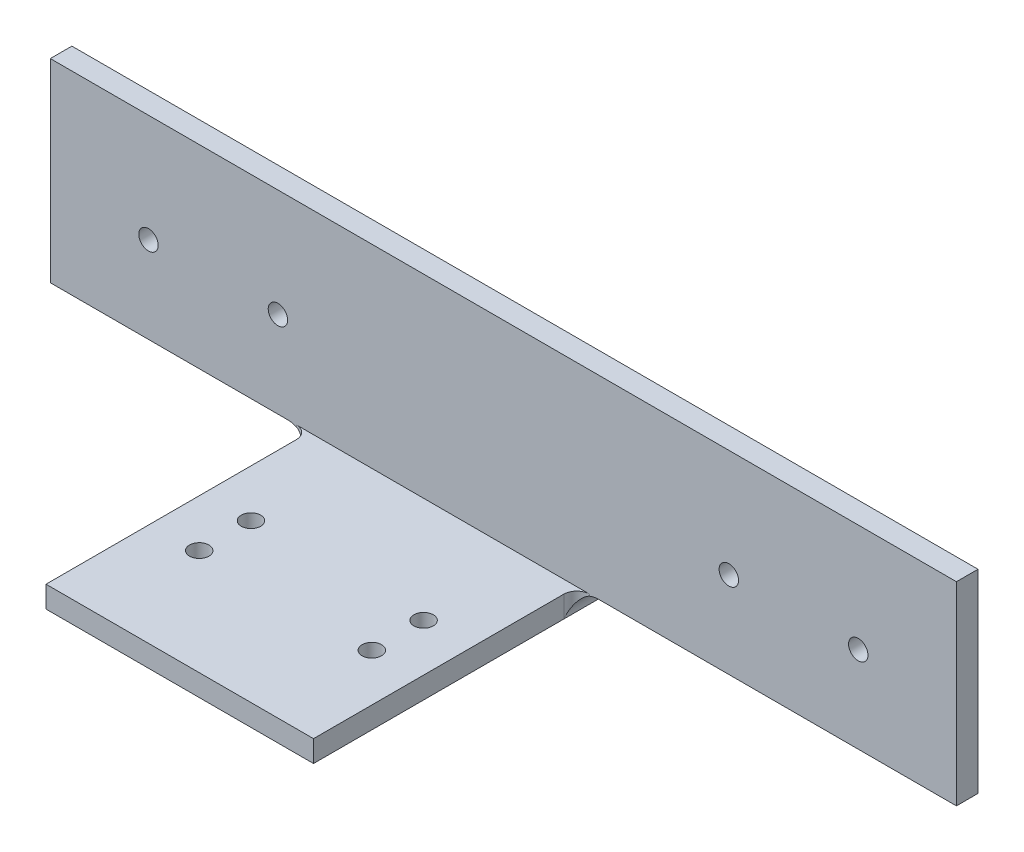
ISO-10303-21;
HEADER;
FILE_DESCRIPTION(('STEP AP214'),'2;1');
FILE_NAME('part.step','',(''),(''),'','','');
FILE_SCHEMA(('AUTOMOTIVE_DESIGN { 1 0 10303 214 1 1 1 1 }'));
ENDSEC;
DATA;
#1=APPLICATION_CONTEXT('core data for automotive mechanical design processes');
#2=APPLICATION_PROTOCOL_DEFINITION('international standard','automotive_design',2000,#1);
#3=PRODUCT_CONTEXT('',#1,'mechanical');
#4=PRODUCT('Part','Part','',(#3));
#5=PRODUCT_RELATED_PRODUCT_CATEGORY('part','',(#4));
#6=PRODUCT_DEFINITION_FORMATION('','',#4);
#7=PRODUCT_DEFINITION_CONTEXT('part definition',#1,'design');
#8=PRODUCT_DEFINITION('design','',#6,#7);
#9=PRODUCT_DEFINITION_SHAPE('','',#8);
#10=(LENGTH_UNIT() NAMED_UNIT(*) SI_UNIT(.MILLI.,.METRE.));
#11=(NAMED_UNIT(*) PLANE_ANGLE_UNIT() SI_UNIT($,.RADIAN.));
#12=(NAMED_UNIT(*) SI_UNIT($,.STERADIAN.) SOLID_ANGLE_UNIT());
#13=UNCERTAINTY_MEASURE_WITH_UNIT(LENGTH_MEASURE(1.E-05),#10,'distance_accuracy_value','');
#14=(GEOMETRIC_REPRESENTATION_CONTEXT(3) GLOBAL_UNCERTAINTY_ASSIGNED_CONTEXT((#13)) GLOBAL_UNIT_ASSIGNED_CONTEXT((#10,
#11,#12)) REPRESENTATION_CONTEXT('',''));
#15=CARTESIAN_POINT('',(0.,0.,0.));
#16=DIRECTION('',(0.,0.,1.));
#17=DIRECTION('',(1.,0.,0.));
#18=AXIS2_PLACEMENT_3D('',#15,#16,#17);
#19=CARTESIAN_POINT('',(210.,50.,-0.00999999999999959));
#20=DIRECTION('',(-1.,0.,0.));
#21=DIRECTION('',(0.,0.,1.));
#22=AXIS2_PLACEMENT_3D('',#19,#20,#21);
#23=PLANE('',#22);
#24=DIRECTION('',(0.,1.,0.));
#25=VECTOR('',#24,1.);
#26=CARTESIAN_POINT('',(210.,0.,0.));
#27=LINE('',#26,#25);
#28=CARTESIAN_POINT('',(210.,5.,0.));
#29=VERTEX_POINT('',#28);
#30=CARTESIAN_POINT('',(210.,50.,0.));
#31=VERTEX_POINT('',#30);
#32=EDGE_CURVE('E322',#29,#31,#27,.T.);
#33=ORIENTED_EDGE('',*,*,#32,.F.);
#34=DIRECTION('',(0.,0.,1.));
#35=VECTOR('',#34,1.);
#36=CARTESIAN_POINT('',(210.,5.,-0.001000000000001));
#37=LINE('',#36,#35);
#38=CARTESIAN_POINT('',(210.,5.,5.));
#39=VERTEX_POINT('',#38);
#40=EDGE_CURVE('E332',#29,#39,#37,.T.);
#41=ORIENTED_EDGE('',*,*,#40,.T.);
#42=DIRECTION('',(0.,1.,0.));
#43=VECTOR('',#42,1.);
#44=CARTESIAN_POINT('',(210.,0.,5.));
#45=LINE('',#44,#43);
#46=CARTESIAN_POINT('',(210.,50.,5.));
#47=VERTEX_POINT('',#46);
#48=EDGE_CURVE('E326',#39,#47,#45,.T.);
#49=ORIENTED_EDGE('',*,*,#48,.T.);
#50=DIRECTION('',(0.,0.,-1.));
#51=VECTOR('',#50,1.);
#52=CARTESIAN_POINT('',(210.,50.,5.));
#53=LINE('',#52,#51);
#54=EDGE_CURVE('E329',#47,#31,#53,.T.);
#55=ORIENTED_EDGE('',*,*,#54,.T.);
#56=EDGE_LOOP('',(#33,#41,#49,#55));
#57=FACE_BOUND('',#56,.T.);
#58=ADVANCED_FACE('F37',(#57),#23,.T.);
#59=CARTESIAN_POINT('',(0.,0.,0.));
#60=DIRECTION('',(0.,0.,-1.));
#61=DIRECTION('',(-1.,0.,0.));
#62=AXIS2_PLACEMENT_3D('',#59,#60,#61);
#63=PLANE('',#62);
#64=CARTESIAN_POINT('',(397.25,25.0000000000002,0.));
#65=DIRECTION('',(0.,0.,1.));
#66=DIRECTION('',(1.,0.,0.));
#67=AXIS2_PLACEMENT_3D('',#64,#65,#66);
#68=CIRCLE('',#67,2.25000000000001);
#69=CARTESIAN_POINT('',(399.5,25.0000000000002,0.));
#70=VERTEX_POINT('',#69);
#71=EDGE_CURVE('E273',#70,#70,#68,.T.);
#72=ORIENTED_EDGE('',*,*,#71,.T.);
#73=EDGE_LOOP('',(#72));
#74=FACE_BOUND('',#73,.T.);
#75=CARTESIAN_POINT('',(367.25,25.0000000000001,0.));
#76=DIRECTION('',(0.,0.,1.));
#77=DIRECTION('',(1.,0.,0.));
#78=AXIS2_PLACEMENT_3D('',#75,#76,#77);
#79=CIRCLE('',#78,2.25000000000001);
#80=CARTESIAN_POINT('',(369.5,25.0000000000001,0.));
#81=VERTEX_POINT('',#80);
#82=EDGE_CURVE('E267',#81,#81,#79,.T.);
#83=ORIENTED_EDGE('',*,*,#82,.T.);
#84=EDGE_LOOP('',(#83));
#85=FACE_BOUND('',#84,.T.);
#86=CARTESIAN_POINT('',(232.75,25.,0.));
#87=DIRECTION('',(0.,0.,-1.));
#88=DIRECTION('',(-1.,0.,0.));
#89=AXIS2_PLACEMENT_3D('',#86,#87,#88);
#90=CIRCLE('',#89,2.25000000000001);
#91=CARTESIAN_POINT('',(230.5,25.,0.));
#92=VERTEX_POINT('',#91);
#93=EDGE_CURVE('E255',#92,#92,#90,.T.);
#94=ORIENTED_EDGE('',*,*,#93,.F.);
#95=EDGE_LOOP('',(#94));
#96=FACE_BOUND('',#95,.T.);
#97=CARTESIAN_POINT('',(262.75,25.,0.));
#98=DIRECTION('',(0.,0.,-1.));
#99=DIRECTION('',(-1.,0.,0.));
#100=AXIS2_PLACEMENT_3D('',#97,#98,#99);
#101=CIRCLE('',#100,2.25000000000001);
#102=CARTESIAN_POINT('',(260.5,25.,0.));
#103=VERTEX_POINT('',#102);
#104=EDGE_CURVE('E261',#103,#103,#101,.T.);
#105=ORIENTED_EDGE('',*,*,#104,.F.);
#106=EDGE_LOOP('',(#105));
#107=FACE_BOUND('',#106,.T.);
#108=DIRECTION('',(-1.,0.,0.));
#109=VECTOR('',#108,1.);
#110=CARTESIAN_POINT('',(420.,0.,0.));
#111=LINE('',#110,#109);
#112=CARTESIAN_POINT('',(332.,0.,0.));
#113=VERTEX_POINT('',#112);
#114=CARTESIAN_POINT('',(270.,0.,0.));
#115=VERTEX_POINT('',#114);
#116=EDGE_CURVE('E242',#113,#115,#111,.T.);
#117=ORIENTED_EDGE('',*,*,#116,.T.);
#118=CARTESIAN_POINT('',(265.,0.,0.));
#119=DIRECTION('',(0.,0.,-1.));
#120=DIRECTION('',(-1.,0.,0.));
#121=AXIS2_PLACEMENT_3D('',#118,#119,#120);
#122=CIRCLE('',#121,5.);
#123=CARTESIAN_POINT('',(265.,5.00000000000001,0.));
#124=VERTEX_POINT('',#123);
#125=EDGE_CURVE('E123',#115,#124,#122,.F.);
#126=ORIENTED_EDGE('',*,*,#125,.T.);
#127=DIRECTION('',(-1.,0.,0.));
#128=VECTOR('',#127,1.);
#129=CARTESIAN_POINT('',(210.,5.,0.));
#130=LINE('',#129,#128);
#131=EDGE_CURVE('E247',#124,#29,#130,.T.);
#132=ORIENTED_EDGE('',*,*,#131,.T.);
#133=ORIENTED_EDGE('',*,*,#32,.T.);
#134=DIRECTION('',(-1.,0.,0.));
#135=VECTOR('',#134,1.);
#136=CARTESIAN_POINT('',(0.,50.,0.));
#137=LINE('',#136,#135);
#138=CARTESIAN_POINT('',(420.,50.,0.));
#139=VERTEX_POINT('',#138);
#140=EDGE_CURVE('E336',#139,#31,#137,.T.);
#141=ORIENTED_EDGE('',*,*,#140,.F.);
#142=DIRECTION('',(0.,-1.,0.));
#143=VECTOR('',#142,1.);
#144=CARTESIAN_POINT('',(420.,0.,0.));
#145=LINE('',#144,#143);
#146=CARTESIAN_POINT('',(420.,4.99999999999998,0.));
#147=VERTEX_POINT('',#146);
#148=EDGE_CURVE('E245',#139,#147,#145,.T.);
#149=ORIENTED_EDGE('',*,*,#148,.T.);
#150=DIRECTION('',(1.,0.,0.));
#151=VECTOR('',#150,1.);
#152=CARTESIAN_POINT('',(420.,4.99999999999997,0.));
#153=LINE('',#152,#151);
#154=CARTESIAN_POINT('',(337.,4.99999999999998,0.));
#155=VERTEX_POINT('',#154);
#156=EDGE_CURVE('E294',#155,#147,#153,.T.);
#157=ORIENTED_EDGE('',*,*,#156,.F.);
#158=CARTESIAN_POINT('',(337.,0.,0.));
#159=DIRECTION('',(0.,0.,-1.));
#160=DIRECTION('',(-1.,0.,0.));
#161=AXIS2_PLACEMENT_3D('',#158,#159,#160);
#162=CIRCLE('',#161,5.);
#163=EDGE_CURVE('E351',#155,#113,#162,.F.);
#164=ORIENTED_EDGE('',*,*,#163,.T.);
#165=EDGE_LOOP('',(#117,#126,#132,#133,#141,#149,#157,#164));
#166=FACE_BOUND('',#165,.T.);
#167=ADVANCED_FACE('F155',(#74,#85,#96,#107,#166),#63,.T.);
#168=CARTESIAN_POINT('',(0.,0.,5.));
#169=DIRECTION('',(0.,0.,-1.));
#170=DIRECTION('',(-1.,0.,0.));
#171=AXIS2_PLACEMENT_3D('',#168,#169,#170);
#172=PLANE('',#171);
#173=CARTESIAN_POINT('',(397.25,25.0000000000002,5.));
#174=DIRECTION('',(0.,0.,1.));
#175=DIRECTION('',(1.,0.,0.));
#176=AXIS2_PLACEMENT_3D('',#173,#174,#175);
#177=CIRCLE('',#176,2.25000000000001);
#178=CARTESIAN_POINT('',(399.5,25.0000000000002,5.));
#179=VERTEX_POINT('',#178);
#180=EDGE_CURVE('E270',#179,#179,#177,.T.);
#181=ORIENTED_EDGE('',*,*,#180,.F.);
#182=EDGE_LOOP('',(#181));
#183=FACE_BOUND('',#182,.T.);
#184=CARTESIAN_POINT('',(232.75,25.,5.));
#185=DIRECTION('',(0.,0.,-1.));
#186=DIRECTION('',(-1.,0.,0.));
#187=AXIS2_PLACEMENT_3D('',#184,#185,#186);
#188=CIRCLE('',#187,2.25000000000001);
#189=CARTESIAN_POINT('',(230.5,25.,5.));
#190=VERTEX_POINT('',#189);
#191=EDGE_CURVE('E251',#190,#190,#188,.T.);
#192=ORIENTED_EDGE('',*,*,#191,.T.);
#193=EDGE_LOOP('',(#192));
#194=FACE_BOUND('',#193,.T.);
#195=CARTESIAN_POINT('',(262.75,25.,5.));
#196=DIRECTION('',(0.,0.,-1.));
#197=DIRECTION('',(-1.,0.,0.));
#198=AXIS2_PLACEMENT_3D('',#195,#196,#197);
#199=CIRCLE('',#198,2.25000000000001);
#200=CARTESIAN_POINT('',(260.5,25.,5.));
#201=VERTEX_POINT('',#200);
#202=EDGE_CURVE('E258',#201,#201,#199,.T.);
#203=ORIENTED_EDGE('',*,*,#202,.T.);
#204=EDGE_LOOP('',(#203));
#205=FACE_BOUND('',#204,.T.);
#206=CARTESIAN_POINT('',(367.25,25.0000000000001,5.));
#207=DIRECTION('',(0.,0.,1.));
#208=DIRECTION('',(1.,0.,0.));
#209=AXIS2_PLACEMENT_3D('',#206,#207,#208);
#210=CIRCLE('',#209,2.25000000000001);
#211=CARTESIAN_POINT('',(369.5,25.0000000000001,5.));
#212=VERTEX_POINT('',#211);
#213=EDGE_CURVE('E264',#212,#212,#210,.T.);
#214=ORIENTED_EDGE('',*,*,#213,.F.);
#215=EDGE_LOOP('',(#214));
#216=FACE_BOUND('',#215,.T.);
#217=CARTESIAN_POINT('',(265.,0.,5.));
#218=DIRECTION('',(0.,0.,-1.));
#219=DIRECTION('',(-1.,0.,0.));
#220=AXIS2_PLACEMENT_3D('',#217,#218,#219);
#221=CIRCLE('',#220,5.);
#222=CARTESIAN_POINT('',(265.,5.00000000000001,5.));
#223=VERTEX_POINT('',#222);
#224=CARTESIAN_POINT('',(267.,4.58257569495585,5.));
#225=VERTEX_POINT('',#224);
#226=EDGE_CURVE('E354',#223,#225,#221,.T.);
#227=ORIENTED_EDGE('',*,*,#226,.T.);
#228=DIRECTION('',(0.,-1.,0.));
#229=VECTOR('',#228,1.);
#230=CARTESIAN_POINT('',(267.,0.,5.));
#231=LINE('',#230,#229);
#232=CARTESIAN_POINT('',(267.,4.99999999999999,5.));
#233=VERTEX_POINT('',#232);
#234=EDGE_CURVE('E108',#225,#233,#231,.F.);
#235=ORIENTED_EDGE('',*,*,#234,.T.);
#236=DIRECTION('',(1.,0.,0.));
#237=VECTOR('',#236,1.);
#238=CARTESIAN_POINT('',(210.,5.,5.));
#239=LINE('',#238,#237);
#240=CARTESIAN_POINT('',(335.,4.99999999999998,5.));
#241=VERTEX_POINT('',#240);
#242=EDGE_CURVE('E101',#233,#241,#239,.T.);
#243=ORIENTED_EDGE('',*,*,#242,.T.);
#244=DIRECTION('',(0.,1.,0.));
#245=VECTOR('',#244,1.);
#246=CARTESIAN_POINT('',(335.,0.,5.));
#247=LINE('',#246,#245);
#248=CARTESIAN_POINT('',(335.,4.58257569495584,5.));
#249=VERTEX_POINT('',#248);
#250=EDGE_CURVE('E105',#241,#249,#247,.F.);
#251=ORIENTED_EDGE('',*,*,#250,.T.);
#252=CARTESIAN_POINT('',(337.,0.,5.));
#253=DIRECTION('',(0.,0.,-1.));
#254=DIRECTION('',(-1.,0.,0.));
#255=AXIS2_PLACEMENT_3D('',#252,#253,#254);
#256=CIRCLE('',#255,5.);
#257=CARTESIAN_POINT('',(337.,4.99999999999998,5.));
#258=VERTEX_POINT('',#257);
#259=EDGE_CURVE('E349',#249,#258,#256,.T.);
#260=ORIENTED_EDGE('',*,*,#259,.T.);
#261=DIRECTION('',(1.,0.,0.));
#262=VECTOR('',#261,1.);
#263=CARTESIAN_POINT('',(420.,4.99999999999997,5.));
#264=LINE('',#263,#262);
#265=CARTESIAN_POINT('',(420.,4.99999999999997,5.));
#266=VERTEX_POINT('',#265);
#267=EDGE_CURVE('E285',#258,#266,#264,.T.);
#268=ORIENTED_EDGE('',*,*,#267,.T.);
#269=DIRECTION('',(0.,-1.,0.));
#270=VECTOR('',#269,1.);
#271=CARTESIAN_POINT('',(420.,0.,5.));
#272=LINE('',#271,#270);
#273=CARTESIAN_POINT('',(420.,50.,5.));
#274=VERTEX_POINT('',#273);
#275=EDGE_CURVE('E228',#274,#266,#272,.T.);
#276=ORIENTED_EDGE('',*,*,#275,.F.);
#277=DIRECTION('',(-1.,0.,0.));
#278=VECTOR('',#277,1.);
#279=CARTESIAN_POINT('',(0.,50.,5.));
#280=LINE('',#279,#278);
#281=EDGE_CURVE('E325',#274,#47,#280,.T.);
#282=ORIENTED_EDGE('',*,*,#281,.T.);
#283=ORIENTED_EDGE('',*,*,#48,.F.);
#284=DIRECTION('',(-1.,0.,0.));
#285=VECTOR('',#284,1.);
#286=CARTESIAN_POINT('',(210.,5.,5.));
#287=LINE('',#286,#285);
#288=EDGE_CURVE('E339',#223,#39,#287,.T.);
#289=ORIENTED_EDGE('',*,*,#288,.F.);
#290=EDGE_LOOP('',(#227,#235,#243,#251,#260,#268,#276,#282,#283,#289));
#291=FACE_BOUND('',#290,.T.);
#292=ADVANCED_FACE('F103',(#183,#194,#205,#216,#291),#172,.F.);
#293=CARTESIAN_POINT('',(0.,50.,5.));
#294=DIRECTION('',(0.,-1.,0.));
#295=DIRECTION('',(0.,0.,-1.));
#296=AXIS2_PLACEMENT_3D('',#293,#294,#295);
#297=PLANE('',#296);
#298=ORIENTED_EDGE('',*,*,#54,.F.);
#299=ORIENTED_EDGE('',*,*,#281,.F.);
#300=DIRECTION('',(0.,0.,-1.));
#301=VECTOR('',#300,1.);
#302=CARTESIAN_POINT('',(420.,50.,5.));
#303=LINE('',#302,#301);
#304=EDGE_CURVE('E236',#274,#139,#303,.T.);
#305=ORIENTED_EDGE('',*,*,#304,.T.);
#306=ORIENTED_EDGE('',*,*,#140,.T.);
#307=EDGE_LOOP('',(#298,#299,#305,#306));
#308=FACE_BOUND('',#307,.T.);
#309=ADVANCED_FACE('F146',(#308),#297,.F.);
#310=CARTESIAN_POINT('',(210.,5.,-0.001000000000001));
#311=DIRECTION('',(0.,1.,0.));
#312=DIRECTION('',(-1.,0.,0.));
#313=AXIS2_PLACEMENT_3D('',#310,#311,#312);
#314=PLANE('',#313);
#315=ORIENTED_EDGE('',*,*,#131,.F.);
#316=DIRECTION('',(0.,0.,1.));
#317=VECTOR('',#316,1.);
#318=CARTESIAN_POINT('',(265.,5.00000000000001,-0.001000000000001));
#319=LINE('',#318,#317);
#320=EDGE_CURVE('E346',#124,#223,#319,.T.);
#321=ORIENTED_EDGE('',*,*,#320,.T.);
#322=ORIENTED_EDGE('',*,*,#288,.T.);
#323=ORIENTED_EDGE('',*,*,#40,.F.);
#324=EDGE_LOOP('',(#315,#321,#322,#323));
#325=FACE_BOUND('',#324,.T.);
#326=ADVANCED_FACE('F149',(#325),#314,.F.);
#327=CARTESIAN_POINT('',(420.,0.,5.));
#328=DIRECTION('',(1.,0.,0.));
#329=DIRECTION('',(0.,0.,-1.));
#330=AXIS2_PLACEMENT_3D('',#327,#328,#329);
#331=PLANE('',#330);
#332=ORIENTED_EDGE('',*,*,#275,.T.);
#333=DIRECTION('',(0.,0.,1.));
#334=VECTOR('',#333,1.);
#335=CARTESIAN_POINT('',(420.,4.99999999999997,-0.001000000000001));
#336=LINE('',#335,#334);
#337=EDGE_CURVE('E232',#147,#266,#336,.T.);
#338=ORIENTED_EDGE('',*,*,#337,.F.);
#339=ORIENTED_EDGE('',*,*,#148,.F.);
#340=ORIENTED_EDGE('',*,*,#304,.F.);
#341=EDGE_LOOP('',(#332,#338,#339,#340));
#342=FACE_BOUND('',#341,.T.);
#343=ADVANCED_FACE('F153',(#342),#331,.T.);
#344=CARTESIAN_POINT('',(420.,0.,5.));
#345=DIRECTION('',(0.,-1.,0.));
#346=DIRECTION('',(0.,0.,-1.));
#347=AXIS2_PLACEMENT_3D('',#344,#345,#346);
#348=PLANE('',#347);
#349=CARTESIAN_POINT('',(281.008832491037,0.,29.5));
#350=DIRECTION('',(0.,-1.,0.));
#351=DIRECTION('',(0.,0.,-1.));
#352=AXIS2_PLACEMENT_3D('',#349,#350,#351);
#353=CIRCLE('',#352,2.25000000000001);
#354=CARTESIAN_POINT('',(281.008832491037,0.,27.25));
#355=VERTEX_POINT('',#354);
#356=EDGE_CURVE('E297',#355,#355,#353,.F.);
#357=ORIENTED_EDGE('',*,*,#356,.T.);
#358=EDGE_LOOP('',(#357));
#359=FACE_BOUND('',#358,.T.);
#360=CARTESIAN_POINT('',(321.008832491037,0.,41.5));
#361=DIRECTION('',(0.,-1.,0.));
#362=DIRECTION('',(0.,0.,-1.));
#363=AXIS2_PLACEMENT_3D('',#360,#361,#362);
#364=CIRCLE('',#363,2.25);
#365=CARTESIAN_POINT('',(321.008832491037,0.,39.25));
#366=VERTEX_POINT('',#365);
#367=EDGE_CURVE('E300',#366,#366,#364,.F.);
#368=ORIENTED_EDGE('',*,*,#367,.T.);
#369=EDGE_LOOP('',(#368));
#370=FACE_BOUND('',#369,.T.);
#371=CARTESIAN_POINT('',(281.008832491037,0.,41.5));
#372=DIRECTION('',(0.,-1.,0.));
#373=DIRECTION('',(0.,0.,-1.));
#374=AXIS2_PLACEMENT_3D('',#371,#372,#373);
#375=CIRCLE('',#374,2.25000000000001);
#376=CARTESIAN_POINT('',(281.008832491037,0.,39.25));
#377=VERTEX_POINT('',#376);
#378=EDGE_CURVE('E303',#377,#377,#375,.F.);
#379=ORIENTED_EDGE('',*,*,#378,.T.);
#380=EDGE_LOOP('',(#379));
#381=FACE_BOUND('',#380,.T.);
#382=CARTESIAN_POINT('',(321.008832491037,0.,29.5));
#383=DIRECTION('',(0.,-1.,0.));
#384=DIRECTION('',(0.,0.,-1.));
#385=AXIS2_PLACEMENT_3D('',#382,#383,#384);
#386=CIRCLE('',#385,2.25);
#387=CARTESIAN_POINT('',(321.008832491037,0.,27.25));
#388=VERTEX_POINT('',#387);
#389=EDGE_CURVE('E306',#388,#388,#386,.F.);
#390=ORIENTED_EDGE('',*,*,#389,.T.);
#391=EDGE_LOOP('',(#390));
#392=FACE_BOUND('',#391,.T.);
#393=DIRECTION('',(0.,0.,1.));
#394=VECTOR('',#393,1.);
#395=CARTESIAN_POINT('',(332.,0.,-0.001000000000001));
#396=LINE('',#395,#394);
#397=CARTESIAN_POINT('',(332.,0.,8.));
#398=VERTEX_POINT('',#397);
#399=EDGE_CURVE('E58',#113,#398,#396,.T.);
#400=ORIENTED_EDGE('',*,*,#399,.T.);
#401=CARTESIAN_POINT('',(332.,0.,66.));
#402=VERTEX_POINT('',#401);
#403=EDGE_CURVE('E289',#398,#402,#396,.T.);
#404=ORIENTED_EDGE('',*,*,#403,.T.);
#405=DIRECTION('',(-1.,0.,0.));
#406=VECTOR('',#405,1.);
#407=CARTESIAN_POINT('',(210.,0.,66.));
#408=LINE('',#407,#406);
#409=CARTESIAN_POINT('',(270.,0.,66.));
#410=VERTEX_POINT('',#409);
#411=EDGE_CURVE('E110',#402,#410,#408,.T.);
#412=ORIENTED_EDGE('',*,*,#411,.T.);
#413=DIRECTION('',(0.,0.,1.));
#414=VECTOR('',#413,1.);
#415=CARTESIAN_POINT('',(270.,0.,-0.001000000000001));
#416=LINE('',#415,#414);
#417=CARTESIAN_POINT('',(270.,0.,8.));
#418=VERTEX_POINT('',#417);
#419=EDGE_CURVE('E281',#418,#410,#416,.T.);
#420=ORIENTED_EDGE('',*,*,#419,.F.);
#421=EDGE_CURVE('E80',#115,#418,#416,.T.);
#422=ORIENTED_EDGE('',*,*,#421,.F.);
#423=ORIENTED_EDGE('',*,*,#116,.F.);
#424=EDGE_LOOP('',(#400,#404,#412,#420,#422,#423));
#425=FACE_BOUND('',#424,.T.);
#426=ADVANCED_FACE('F200',(#359,#370,#381,#392,#425),#348,.T.);
#427=CARTESIAN_POINT('',(210.,5.,66.));
#428=DIRECTION('',(0.,1.,0.));
#429=DIRECTION('',(-1.,0.,0.));
#430=AXIS2_PLACEMENT_3D('',#427,#428,#429);
#431=PLANE('',#430);
#432=CARTESIAN_POINT('',(281.008832491037,4.99999999999999,29.5));
#433=DIRECTION('',(0.,-1.,0.));
#434=DIRECTION('',(1.,0.,0.));
#435=AXIS2_PLACEMENT_3D('',#432,#433,#434);
#436=CIRCLE('',#435,2.25000000000001);
#437=CARTESIAN_POINT('',(283.258832491037,4.99999999999999,29.5));
#438=VERTEX_POINT('',#437);
#439=EDGE_CURVE('E312',#438,#438,#436,.T.);
#440=ORIENTED_EDGE('',*,*,#439,.T.);
#441=EDGE_LOOP('',(#440));
#442=FACE_BOUND('',#441,.T.);
#443=CARTESIAN_POINT('',(321.008832491037,4.99999999999998,41.5));
#444=DIRECTION('',(0.,-1.,0.));
#445=DIRECTION('',(1.,0.,0.));
#446=AXIS2_PLACEMENT_3D('',#443,#444,#445);
#447=CIRCLE('',#446,2.25);
#448=CARTESIAN_POINT('',(323.258832491037,4.99999999999998,41.5));
#449=VERTEX_POINT('',#448);
#450=EDGE_CURVE('E313',#449,#449,#447,.T.);
#451=ORIENTED_EDGE('',*,*,#450,.T.);
#452=EDGE_LOOP('',(#451));
#453=FACE_BOUND('',#452,.T.);
#454=CARTESIAN_POINT('',(281.008832491037,4.99999999999999,41.5));
#455=DIRECTION('',(0.,-1.,0.));
#456=DIRECTION('',(1.,0.,0.));
#457=AXIS2_PLACEMENT_3D('',#454,#455,#456);
#458=CIRCLE('',#457,2.25000000000001);
#459=CARTESIAN_POINT('',(283.258832491037,4.99999999999999,41.5));
#460=VERTEX_POINT('',#459);
#461=EDGE_CURVE('E316',#460,#460,#458,.T.);
#462=ORIENTED_EDGE('',*,*,#461,.T.);
#463=EDGE_LOOP('',(#462));
#464=FACE_BOUND('',#463,.T.);
#465=CARTESIAN_POINT('',(321.008832491037,4.99999999999998,29.5));
#466=DIRECTION('',(0.,-1.,0.));
#467=DIRECTION('',(1.,0.,0.));
#468=AXIS2_PLACEMENT_3D('',#465,#466,#467);
#469=CIRCLE('',#468,2.25);
#470=CARTESIAN_POINT('',(323.258832491037,4.99999999999998,29.5));
#471=VERTEX_POINT('',#470);
#472=EDGE_CURVE('E309',#471,#471,#469,.T.);
#473=ORIENTED_EDGE('',*,*,#472,.T.);
#474=EDGE_LOOP('',(#473));
#475=FACE_BOUND('',#474,.T.);
#476=DIRECTION('',(0.,0.,1.));
#477=VECTOR('',#476,1.);
#478=CARTESIAN_POINT('',(332.,4.99999999999998,-0.001000000000001));
#479=LINE('',#478,#477);
#480=CARTESIAN_POINT('',(332.,4.99999999999998,8.));
#481=VERTEX_POINT('',#480);
#482=CARTESIAN_POINT('',(332.,4.99999999999998,66.));
#483=VERTEX_POINT('',#482);
#484=EDGE_CURVE('E116',#481,#483,#479,.T.);
#485=ORIENTED_EDGE('',*,*,#484,.F.);
#486=CARTESIAN_POINT('',(335.,4.99999999999998,8.));
#487=DIRECTION('',(0.,1.,0.));
#488=DIRECTION('',(-1.,0.,0.));
#489=AXIS2_PLACEMENT_3D('',#486,#487,#488);
#490=CIRCLE('',#489,3.);
#491=EDGE_CURVE('E51',#481,#241,#490,.F.);
#492=ORIENTED_EDGE('',*,*,#491,.T.);
#493=ORIENTED_EDGE('',*,*,#242,.F.);
#494=CARTESIAN_POINT('',(267.,4.99999999999999,8.));
#495=DIRECTION('',(0.,1.,0.));
#496=DIRECTION('',(-1.,0.,0.));
#497=AXIS2_PLACEMENT_3D('',#494,#495,#496);
#498=CIRCLE('',#497,3.);
#499=CARTESIAN_POINT('',(270.,4.99999999999999,8.));
#500=VERTEX_POINT('',#499);
#501=EDGE_CURVE('E90',#233,#500,#498,.F.);
#502=ORIENTED_EDGE('',*,*,#501,.T.);
#503=DIRECTION('',(0.,0.,1.));
#504=VECTOR('',#503,1.);
#505=CARTESIAN_POINT('',(270.,4.99999999999999,-0.001000000000001));
#506=LINE('',#505,#504);
#507=CARTESIAN_POINT('',(270.,4.99999999999999,66.));
#508=VERTEX_POINT('',#507);
#509=EDGE_CURVE('E109',#500,#508,#506,.T.);
#510=ORIENTED_EDGE('',*,*,#509,.T.);
#511=DIRECTION('',(1.,0.,0.));
#512=VECTOR('',#511,1.);
#513=CARTESIAN_POINT('',(210.,5.,66.));
#514=LINE('',#513,#512);
#515=EDGE_CURVE('E254',#508,#483,#514,.T.);
#516=ORIENTED_EDGE('',*,*,#515,.T.);
#517=EDGE_LOOP('',(#485,#492,#493,#502,#510,#516));
#518=FACE_BOUND('',#517,.T.);
#519=ADVANCED_FACE('F113',(#442,#453,#464,#475,#518),#431,.T.);
#520=CARTESIAN_POINT('',(420.,0.,66.));
#521=DIRECTION('',(0.,0.,1.));
#522=DIRECTION('',(-1.,0.,0.));
#523=AXIS2_PLACEMENT_3D('',#520,#521,#522);
#524=PLANE('',#523);
#525=DIRECTION('',(0.,-1.,0.));
#526=VECTOR('',#525,1.);
#527=CARTESIAN_POINT('',(332.,0.,66.));
#528=LINE('',#527,#526);
#529=EDGE_CURVE('E288',#483,#402,#528,.T.);
#530=ORIENTED_EDGE('',*,*,#529,.F.);
#531=ORIENTED_EDGE('',*,*,#515,.F.);
#532=DIRECTION('',(0.,-1.,0.));
#533=VECTOR('',#532,1.);
#534=CARTESIAN_POINT('',(270.,4.99999999999999,66.));
#535=LINE('',#534,#533);
#536=EDGE_CURVE('E280',#508,#410,#535,.T.);
#537=ORIENTED_EDGE('',*,*,#536,.T.);
#538=ORIENTED_EDGE('',*,*,#411,.F.);
#539=EDGE_LOOP('',(#530,#531,#537,#538));
#540=FACE_BOUND('',#539,.T.);
#541=ADVANCED_FACE('F193',(#540),#524,.T.);
#542=CARTESIAN_POINT('',(232.75,25.,0.));
#543=DIRECTION('',(0.,0.,1.));
#544=DIRECTION('',(1.,0.,0.));
#545=AXIS2_PLACEMENT_3D('',#542,#543,#544);
#546=CYLINDRICAL_SURFACE('',#545,2.25000000000001);
#547=ORIENTED_EDGE('',*,*,#93,.T.);
#548=EDGE_LOOP('',(#547));
#549=FACE_BOUND('',#548,.T.);
#550=ORIENTED_EDGE('',*,*,#191,.F.);
#551=EDGE_LOOP('',(#550));
#552=FACE_BOUND('',#551,.T.);
#553=ADVANCED_FACE('F196',(#549,#552),#546,.F.);
#554=CARTESIAN_POINT('',(262.75,25.,0.));
#555=DIRECTION('',(0.,0.,1.));
#556=DIRECTION('',(1.,0.,0.));
#557=AXIS2_PLACEMENT_3D('',#554,#555,#556);
#558=CYLINDRICAL_SURFACE('',#557,2.25000000000001);
#559=ORIENTED_EDGE('',*,*,#104,.T.);
#560=EDGE_LOOP('',(#559));
#561=FACE_BOUND('',#560,.T.);
#562=ORIENTED_EDGE('',*,*,#202,.F.);
#563=EDGE_LOOP('',(#562));
#564=FACE_BOUND('',#563,.T.);
#565=ADVANCED_FACE('F208',(#561,#564),#558,.F.);
#566=CARTESIAN_POINT('',(367.25,25.0000000000001,0.));
#567=DIRECTION('',(0.,0.,1.));
#568=DIRECTION('',(1.,0.,0.));
#569=AXIS2_PLACEMENT_3D('',#566,#567,#568);
#570=CYLINDRICAL_SURFACE('',#569,2.25000000000001);
#571=ORIENTED_EDGE('',*,*,#82,.F.);
#572=EDGE_LOOP('',(#571));
#573=FACE_BOUND('',#572,.T.);
#574=ORIENTED_EDGE('',*,*,#213,.T.);
#575=EDGE_LOOP('',(#574));
#576=FACE_BOUND('',#575,.T.);
#577=ADVANCED_FACE('F204',(#573,#576),#570,.F.);
#578=CARTESIAN_POINT('',(397.25,25.0000000000002,0.));
#579=DIRECTION('',(0.,0.,1.));
#580=DIRECTION('',(1.,0.,0.));
#581=AXIS2_PLACEMENT_3D('',#578,#579,#580);
#582=CYLINDRICAL_SURFACE('',#581,2.25000000000001);
#583=ORIENTED_EDGE('',*,*,#71,.F.);
#584=EDGE_LOOP('',(#583));
#585=FACE_BOUND('',#584,.T.);
#586=ORIENTED_EDGE('',*,*,#180,.T.);
#587=EDGE_LOOP('',(#586));
#588=FACE_BOUND('',#587,.T.);
#589=ADVANCED_FACE('F191',(#585,#588),#582,.F.);
#590=CARTESIAN_POINT('',(270.,4.99999999999999,-0.001000000000001));
#591=DIRECTION('',(-1.,0.,0.));
#592=DIRECTION('',(0.,0.,1.));
#593=AXIS2_PLACEMENT_3D('',#590,#591,#592);
#594=PLANE('',#593);
#595=ORIENTED_EDGE('',*,*,#509,.F.);
#596=DIRECTION('',(0.,-1.,0.));
#597=VECTOR('',#596,1.);
#598=CARTESIAN_POINT('',(270.,4.99999999999999,8.));
#599=LINE('',#598,#597);
#600=EDGE_CURVE('E118',#500,#418,#599,.T.);
#601=ORIENTED_EDGE('',*,*,#600,.T.);
#602=ORIENTED_EDGE('',*,*,#419,.T.);
#603=ORIENTED_EDGE('',*,*,#536,.F.);
#604=EDGE_LOOP('',(#595,#601,#602,#603));
#605=FACE_BOUND('',#604,.T.);
#606=ADVANCED_FACE('F184',(#605),#594,.T.);
#607=CARTESIAN_POINT('',(420.,4.99999999999997,-0.001000000000001));
#608=DIRECTION('',(0.,-1.,0.));
#609=DIRECTION('',(1.,0.,0.));
#610=AXIS2_PLACEMENT_3D('',#607,#608,#609);
#611=PLANE('',#610);
#612=ORIENTED_EDGE('',*,*,#267,.F.);
#613=DIRECTION('',(0.,0.,1.));
#614=VECTOR('',#613,1.);
#615=CARTESIAN_POINT('',(337.,4.99999999999998,-0.001000000000001));
#616=LINE('',#615,#614);
#617=EDGE_CURVE('E321',#258,#155,#616,.F.);
#618=ORIENTED_EDGE('',*,*,#617,.T.);
#619=ORIENTED_EDGE('',*,*,#156,.T.);
#620=ORIENTED_EDGE('',*,*,#337,.T.);
#621=EDGE_LOOP('',(#612,#618,#619,#620));
#622=FACE_BOUND('',#621,.T.);
#623=ADVANCED_FACE('F181',(#622),#611,.T.);
#624=CARTESIAN_POINT('',(332.,0.,-0.001000000000001));
#625=DIRECTION('',(-1.,0.,0.));
#626=DIRECTION('',(0.,0.,1.));
#627=AXIS2_PLACEMENT_3D('',#624,#625,#626);
#628=PLANE('',#627);
#629=ORIENTED_EDGE('',*,*,#403,.F.);
#630=DIRECTION('',(0.,1.,0.));
#631=VECTOR('',#630,1.);
#632=CARTESIAN_POINT('',(332.,4.99999999999998,8.));
#633=LINE('',#632,#631);
#634=EDGE_CURVE('E120',#398,#481,#633,.T.);
#635=ORIENTED_EDGE('',*,*,#634,.T.);
#636=ORIENTED_EDGE('',*,*,#484,.T.);
#637=ORIENTED_EDGE('',*,*,#529,.T.);
#638=EDGE_LOOP('',(#629,#635,#636,#637));
#639=FACE_BOUND('',#638,.T.);
#640=ADVANCED_FACE('F179',(#639),#628,.F.);
#641=CARTESIAN_POINT('',(321.008832491037,-0.301262183920644,29.5));
#642=DIRECTION('',(0.,1.,0.));
#643=DIRECTION('',(-1.,0.,0.));
#644=AXIS2_PLACEMENT_3D('',#641,#642,#643);
#645=CYLINDRICAL_SURFACE('',#644,2.25);
#646=ORIENTED_EDGE('',*,*,#389,.F.);
#647=EDGE_LOOP('',(#646));
#648=FACE_BOUND('',#647,.T.);
#649=ORIENTED_EDGE('',*,*,#472,.F.);
#650=EDGE_LOOP('',(#649));
#651=FACE_BOUND('',#650,.T.);
#652=ADVANCED_FACE('F169',(#648,#651),#645,.F.);
#653=CARTESIAN_POINT('',(281.008832491037,-0.301262183920639,41.5));
#654=DIRECTION('',(0.,1.,0.));
#655=DIRECTION('',(-1.,0.,0.));
#656=AXIS2_PLACEMENT_3D('',#653,#654,#655);
#657=CYLINDRICAL_SURFACE('',#656,2.25000000000001);
#658=ORIENTED_EDGE('',*,*,#378,.F.);
#659=EDGE_LOOP('',(#658));
#660=FACE_BOUND('',#659,.T.);
#661=ORIENTED_EDGE('',*,*,#461,.F.);
#662=EDGE_LOOP('',(#661));
#663=FACE_BOUND('',#662,.T.);
#664=ADVANCED_FACE('F165',(#660,#663),#657,.F.);
#665=CARTESIAN_POINT('',(321.008832491037,-0.301262183920644,41.5));
#666=DIRECTION('',(0.,1.,0.));
#667=DIRECTION('',(-1.,0.,0.));
#668=AXIS2_PLACEMENT_3D('',#665,#666,#667);
#669=CYLINDRICAL_SURFACE('',#668,2.25);
#670=ORIENTED_EDGE('',*,*,#367,.F.);
#671=EDGE_LOOP('',(#670));
#672=FACE_BOUND('',#671,.T.);
#673=ORIENTED_EDGE('',*,*,#450,.F.);
#674=EDGE_LOOP('',(#673));
#675=FACE_BOUND('',#674,.T.);
#676=ADVANCED_FACE('F168',(#672,#675),#669,.F.);
#677=CARTESIAN_POINT('',(281.008832491037,-0.301262183920639,29.5));
#678=DIRECTION('',(0.,1.,0.));
#679=DIRECTION('',(-1.,0.,0.));
#680=AXIS2_PLACEMENT_3D('',#677,#678,#679);
#681=CYLINDRICAL_SURFACE('',#680,2.25000000000001);
#682=ORIENTED_EDGE('',*,*,#356,.F.);
#683=EDGE_LOOP('',(#682));
#684=FACE_BOUND('',#683,.T.);
#685=ORIENTED_EDGE('',*,*,#439,.F.);
#686=EDGE_LOOP('',(#685));
#687=FACE_BOUND('',#686,.T.);
#688=ADVANCED_FACE('F144',(#684,#687),#681,.F.);
#689=CARTESIAN_POINT('',(337.,0.,-0.001000000000001));
#690=DIRECTION('',(0.,0.,1.));
#691=DIRECTION('',(1.,0.,0.));
#692=AXIS2_PLACEMENT_3D('',#689,#690,#691);
#693=CYLINDRICAL_SURFACE('',#692,5.);
#694=ORIENTED_EDGE('',*,*,#163,.F.);
#695=ORIENTED_EDGE('',*,*,#617,.F.);
#696=ORIENTED_EDGE('',*,*,#259,.F.);
#697=CARTESIAN_POINT('',(335.,4.58257569495584,5.));
#698=CARTESIAN_POINT('',(334.911111119998,4.54380566427322,4.99999007584464));
#699=CARTESIAN_POINT('',(334.823423962833,4.50243446840084,5.00394885534584));
#700=CARTESIAN_POINT('',(334.651220341911,4.41502907539,5.01909527387802));
#701=CARTESIAN_POINT('',(334.566698927635,4.36900261425667,5.03027108102269));
#702=CARTESIAN_POINT('',(334.40214197951,4.27318684934747,5.05900041117812));
#703=CARTESIAN_POINT('',(334.322069509902,4.22344066986966,5.07648778239046));
#704=CARTESIAN_POINT('',(334.165832250645,4.12022597013018,5.11717439439445));
#705=CARTESIAN_POINT('',(334.089669495081,4.06675554569602,5.14037657272063));
#706=CARTESIAN_POINT('',(333.922176555421,3.94215157533582,5.19855781113316));
#707=CARTESIAN_POINT('',(333.832081831232,3.87005286359252,5.23503000053934));
#708=CARTESIAN_POINT('',(333.658757846319,3.72144447976094,5.3148218834273));
#709=CARTESIAN_POINT('',(333.575533649468,3.64493162358562,5.35814656010762));
#710=CARTESIAN_POINT('',(333.41570229295,3.48789577015659,5.45077079658605));
#711=CARTESIAN_POINT('',(333.339126062405,3.40735651751837,5.50009596147953));
#712=CARTESIAN_POINT('',(333.192958526756,3.24322536799945,5.60362354169447));
#713=CARTESIAN_POINT('',(333.12336518725,3.15963436995296,5.6578245277114));
#714=CARTESIAN_POINT('',(332.96462300081,2.95607536442496,5.79274014298282));
#715=CARTESIAN_POINT('',(332.878717626932,2.83487272934037,5.87542029554431));
#716=CARTESIAN_POINT('',(332.719714953924,2.5885639036032,6.04705542389679));
#717=CARTESIAN_POINT('',(332.646622768737,2.46345617772965,6.13601288528318));
#718=CARTESIAN_POINT('',(332.512740907307,2.21020934180586,6.31881575359719));
#719=CARTESIAN_POINT('',(332.451955504527,2.08206919595649,6.41266284424723));
#720=CARTESIAN_POINT('',(332.342282611467,1.82356111642588,6.60404313592417));
#721=CARTESIAN_POINT('',(332.293393239163,1.69319353863484,6.70157575105478));
#722=CARTESIAN_POINT('',(332.1665023697,1.30736237891216,6.99243555246868));
#723=CARTESIAN_POINT('',(332.104332450162,1.04949814552301,7.18963215160433));
#724=CARTESIAN_POINT('',(332.021420089874,0.531399559952682,7.58839523182415));
#725=CARTESIAN_POINT('',(332.000593365384,0.271171118469292,7.78995197387399));
#726=CARTESIAN_POINT('',(332.00000417362,0.00745351060396684,7.99422653603183));
#727=CARTESIAN_POINT('',(332.000000007282,0.0037267284084396,7.9971132891276));
#728=CARTESIAN_POINT('',(332.,0.,8.));
#729=B_SPLINE_CURVE_WITH_KNOTS('',3,(#697,#698,#699,#700,#701,#702,#703,#704,#705,#706,#707,
#708,#709,#710,#711,#712,#713,#714,#715,#716,#717,#718,#719,#720,#721,#722,#723,#724,#725,#726,
#727,#728),.UNSPECIFIED.,.F.,.F.,(4,2,2,2,2,2,2,2,2,2,2,2,2,2,2,4),(0.,0.290715926078944,
0.580956446582289,0.868239309782241,1.15567015190114,1.51818907481713,1.88097284765799,
2.24536288350866,2.60964644752266,3.11894232553593,3.62844101097618,4.13811631474595,
4.64771093234494,5.63631090330858,6.62289340018379,6.63703554133181),.UNSPECIFIED.);
#730=EDGE_CURVE('E11',#249,#398,#729,.T.);
#731=ORIENTED_EDGE('',*,*,#730,.T.);
#732=ORIENTED_EDGE('',*,*,#399,.F.);
#733=EDGE_LOOP('',(#694,#695,#696,#731,#732));
#734=FACE_BOUND('',#733,.T.);
#735=ADVANCED_FACE('F140',(#734),#693,.F.);
#736=CARTESIAN_POINT('',(265.,0.,-0.001000000000001));
#737=DIRECTION('',(0.,0.,1.));
#738=DIRECTION('',(1.,0.,0.));
#739=AXIS2_PLACEMENT_3D('',#736,#737,#738);
#740=CYLINDRICAL_SURFACE('',#739,5.);
#741=ORIENTED_EDGE('',*,*,#125,.F.);
#742=ORIENTED_EDGE('',*,*,#421,.T.);
#743=CARTESIAN_POINT('',(267.,4.58257569495585,5.));
#744=CARTESIAN_POINT('',(267.088888880002,4.54380566427323,4.99999007584464));
#745=CARTESIAN_POINT('',(267.176576037167,4.50243446840084,5.00394885534584));
#746=CARTESIAN_POINT('',(267.348779658089,4.41502907539001,5.01909527387802));
#747=CARTESIAN_POINT('',(267.433301072365,4.36900261425668,5.03027108102269));
#748=CARTESIAN_POINT('',(267.59785802049,4.27318684934749,5.05900041117812));
#749=CARTESIAN_POINT('',(267.677930490098,4.22344066986968,5.07648778239046));
#750=CARTESIAN_POINT('',(267.834167749355,4.12022597013021,5.11717439439444));
#751=CARTESIAN_POINT('',(267.910330504919,4.06675554569604,5.14037657272063));
#752=CARTESIAN_POINT('',(268.077823444579,3.94215157533584,5.19855781113315));
#753=CARTESIAN_POINT('',(268.167918168767,3.87005286359255,5.23503000053933));
#754=CARTESIAN_POINT('',(268.341242153681,3.72144447976098,5.31482188342728));
#755=CARTESIAN_POINT('',(268.424466350532,3.64493162358567,5.35814656010759));
#756=CARTESIAN_POINT('',(268.58429770705,3.48789577015664,5.45077079658603));
#757=CARTESIAN_POINT('',(268.660873937595,3.40735651751841,5.50009596147951));
#758=CARTESIAN_POINT('',(268.807041473244,3.24322536799947,5.60362354169446));
#759=CARTESIAN_POINT('',(268.87663481275,3.15963436995297,5.6578245277114));
#760=CARTESIAN_POINT('',(269.03537699919,2.95607536442496,5.79274014298282));
#761=CARTESIAN_POINT('',(269.121282373068,2.83487272934037,5.87542029554432));
#762=CARTESIAN_POINT('',(269.280285046076,2.5885639036032,6.0470554238968));
#763=CARTESIAN_POINT('',(269.353377231263,2.46345617772967,6.13601288528318));
#764=CARTESIAN_POINT('',(269.487259092693,2.21020934180588,6.31881575359718));
#765=CARTESIAN_POINT('',(269.548044495473,2.08206919595651,6.41266284424722));
#766=CARTESIAN_POINT('',(269.657717388533,1.82356111642589,6.60404313592417));
#767=CARTESIAN_POINT('',(269.706606760837,1.69319353863485,6.70157575105478));
#768=CARTESIAN_POINT('',(269.8334976303,1.30736237891216,6.99243555246867));
#769=CARTESIAN_POINT('',(269.895667549838,1.04949814552302,7.18963215160432));
#770=CARTESIAN_POINT('',(269.978579910126,0.531399559952688,7.58839523182415));
#771=CARTESIAN_POINT('',(269.999406634616,0.271171118469301,7.789951973874));
#772=CARTESIAN_POINT('',(269.99999582638,0.00745351060397341,7.99422653603183));
#773=CARTESIAN_POINT('',(269.999999992718,0.00372672840844607,7.9971132891276));
#774=CARTESIAN_POINT('',(270.,0.,8.));
#775=B_SPLINE_CURVE_WITH_KNOTS('',3,(#743,#744,#745,#746,#747,#748,#749,#750,#751,#752,#753,
#754,#755,#756,#757,#758,#759,#760,#761,#762,#763,#764,#765,#766,#767,#768,#769,#770,#771,#772,
#773,#774),.UNSPECIFIED.,.F.,.F.,(4,2,2,2,2,2,2,2,2,2,2,2,2,2,2,4),(0.,0.290715926078944,
0.580956446582289,0.86823930978218,1.15567015190113,1.51818907481706,1.88097284765791,
2.24536288350865,2.60964644752266,3.11894232553594,3.62844101097616,4.13811631474594,
4.64771093234494,5.63631090330857,6.62289340018379,6.63703554133181),.UNSPECIFIED.);
#776=EDGE_CURVE('E128',#418,#225,#775,.F.);
#777=ORIENTED_EDGE('',*,*,#776,.T.);
#778=ORIENTED_EDGE('',*,*,#226,.F.);
#779=ORIENTED_EDGE('',*,*,#320,.F.);
#780=EDGE_LOOP('',(#741,#742,#777,#778,#779));
#781=FACE_BOUND('',#780,.T.);
#782=ADVANCED_FACE('F137',(#781),#740,.F.);
#783=CARTESIAN_POINT('',(267.,4.99999999999999,8.));
#784=DIRECTION('',(0.,-1.,0.));
#785=DIRECTION('',(0.,0.,-1.));
#786=AXIS2_PLACEMENT_3D('',#783,#784,#785);
#787=CYLINDRICAL_SURFACE('',#786,3.);
#788=ORIENTED_EDGE('',*,*,#501,.F.);
#789=ORIENTED_EDGE('',*,*,#234,.F.);
#790=ORIENTED_EDGE('',*,*,#776,.F.);
#791=ORIENTED_EDGE('',*,*,#600,.F.);
#792=EDGE_LOOP('',(#788,#789,#790,#791));
#793=FACE_BOUND('',#792,.T.);
#794=ADVANCED_FACE('F135',(#793),#787,.F.);
#795=CARTESIAN_POINT('',(335.,0.,8.));
#796=DIRECTION('',(0.,-1.,0.));
#797=DIRECTION('',(0.,0.,-1.));
#798=AXIS2_PLACEMENT_3D('',#795,#796,#797);
#799=CYLINDRICAL_SURFACE('',#798,3.);
#800=ORIENTED_EDGE('',*,*,#730,.F.);
#801=ORIENTED_EDGE('',*,*,#250,.F.);
#802=ORIENTED_EDGE('',*,*,#491,.F.);
#803=ORIENTED_EDGE('',*,*,#634,.F.);
#804=EDGE_LOOP('',(#800,#801,#802,#803));
#805=FACE_BOUND('',#804,.T.);
#806=ADVANCED_FACE('F39',(#805),#799,.F.);
#807=CLOSED_SHELL('',(#58,#167,#292,#309,#326,#343,#426,#519,#541,#553,#565,#577,#589,#606,#623,
#640,#652,#664,#676,#688,#735,#782,#794,#806));
#808=MANIFOLD_SOLID_BREP('B2',#807);
#809=ADVANCED_BREP_SHAPE_REPRESENTATION('',(#18,#808),#14);
#810=SHAPE_DEFINITION_REPRESENTATION(#9,#809);
ENDSEC;
END-ISO-10303-21;
